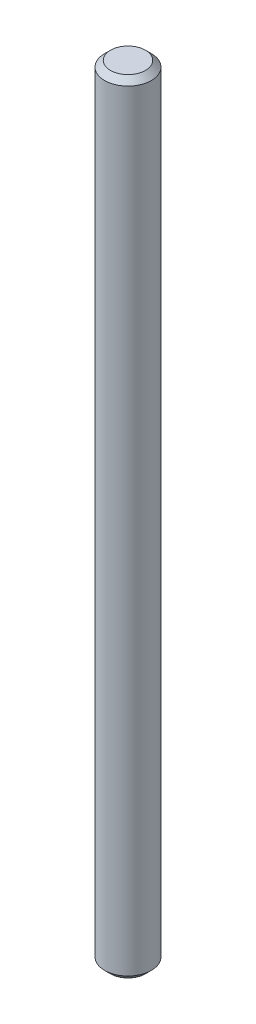
ISO-10303-21;
HEADER;
FILE_DESCRIPTION(('STEP AP214'),'2;1');
FILE_NAME('part.step','',(''),(''),'','','');
FILE_SCHEMA(('AUTOMOTIVE_DESIGN { 1 0 10303 214 1 1 1 1 }'));
ENDSEC;
DATA;
#1=APPLICATION_CONTEXT('core data for automotive mechanical design processes');
#2=APPLICATION_PROTOCOL_DEFINITION('international standard','automotive_design',2000,#1);
#3=PRODUCT_CONTEXT('',#1,'mechanical');
#4=PRODUCT('Part','Part','',(#3));
#5=PRODUCT_RELATED_PRODUCT_CATEGORY('part','',(#4));
#6=PRODUCT_DEFINITION_FORMATION('','',#4);
#7=PRODUCT_DEFINITION_CONTEXT('part definition',#1,'design');
#8=PRODUCT_DEFINITION('design','',#6,#7);
#9=PRODUCT_DEFINITION_SHAPE('','',#8);
#10=(LENGTH_UNIT() NAMED_UNIT(*) SI_UNIT(.MILLI.,.METRE.));
#11=(NAMED_UNIT(*) PLANE_ANGLE_UNIT() SI_UNIT($,.RADIAN.));
#12=(NAMED_UNIT(*) SI_UNIT($,.STERADIAN.) SOLID_ANGLE_UNIT());
#13=UNCERTAINTY_MEASURE_WITH_UNIT(LENGTH_MEASURE(1.E-05),#10,'distance_accuracy_value','');
#14=(GEOMETRIC_REPRESENTATION_CONTEXT(3) GLOBAL_UNCERTAINTY_ASSIGNED_CONTEXT((#13)) GLOBAL_UNIT_ASSIGNED_CONTEXT((#10,
#11,#12)) REPRESENTATION_CONTEXT('',''));
#15=CARTESIAN_POINT('',(0.,0.,0.));
#16=DIRECTION('',(0.,0.,1.));
#17=DIRECTION('',(1.,0.,0.));
#18=AXIS2_PLACEMENT_3D('',#15,#16,#17);
#19=CARTESIAN_POINT('',(0.,134.,0.));
#20=DIRECTION('',(0.,-1.,0.));
#21=DIRECTION('',(0.,0.,-1.));
#22=AXIS2_PLACEMENT_3D('',#19,#20,#21);
#23=CYLINDRICAL_SURFACE('',#22,4.);
#24=CARTESIAN_POINT('',(0.,0.999999999999973,0.));
#25=DIRECTION('',(0.,1.,0.));
#26=DIRECTION('',(0.,0.,1.));
#27=AXIS2_PLACEMENT_3D('',#24,#25,#26);
#28=CIRCLE('',#27,4.);
#29=CARTESIAN_POINT('',(0.,0.999999999999973,4.));
#30=VERTEX_POINT('',#29);
#31=EDGE_CURVE('E47',#30,#30,#28,.T.);
#32=ORIENTED_EDGE('',*,*,#31,.T.);
#33=EDGE_LOOP('',(#32));
#34=FACE_BOUND('',#33,.T.);
#35=CARTESIAN_POINT('',(0.,133.,0.));
#36=DIRECTION('',(0.,1.,0.));
#37=DIRECTION('',(0.,0.,1.));
#38=AXIS2_PLACEMENT_3D('',#35,#36,#37);
#39=CIRCLE('',#38,4.);
#40=CARTESIAN_POINT('',(0.,133.,4.));
#41=VERTEX_POINT('',#40);
#42=EDGE_CURVE('E51',#41,#41,#39,.F.);
#43=ORIENTED_EDGE('',*,*,#42,.T.);
#44=EDGE_LOOP('',(#43));
#45=FACE_BOUND('',#44,.T.);
#46=ADVANCED_FACE('F35',(#34,#45),#23,.T.);
#47=CARTESIAN_POINT('',(0.,134.,0.));
#48=DIRECTION('',(0.,1.,0.));
#49=DIRECTION('',(0.,0.,1.));
#50=AXIS2_PLACEMENT_3D('',#47,#48,#49);
#51=PLANE('',#50);
#52=CARTESIAN_POINT('',(0.,134.,0.));
#53=DIRECTION('',(0.,1.,0.));
#54=DIRECTION('',(0.,0.,1.));
#55=AXIS2_PLACEMENT_3D('',#52,#53,#54);
#56=CIRCLE('',#55,3.);
#57=CARTESIAN_POINT('',(0.,134.,3.));
#58=VERTEX_POINT('',#57);
#59=EDGE_CURVE('E10',#58,#58,#56,.T.);
#60=ORIENTED_EDGE('',*,*,#59,.T.);
#61=EDGE_LOOP('',(#60));
#62=FACE_BOUND('',#61,.T.);
#63=ADVANCED_FACE('F67',(#62),#51,.T.);
#64=CARTESIAN_POINT('',(0.,0.,0.));
#65=DIRECTION('',(0.,1.,0.));
#66=DIRECTION('',(0.,0.,1.));
#67=AXIS2_PLACEMENT_3D('',#64,#65,#66);
#68=PLANE('',#67);
#69=CARTESIAN_POINT('',(0.,0.,0.));
#70=DIRECTION('',(0.,1.,0.));
#71=DIRECTION('',(0.,0.,1.));
#72=AXIS2_PLACEMENT_3D('',#69,#70,#71);
#73=CIRCLE('',#72,3.00000000000002);
#74=CARTESIAN_POINT('',(0.,0.,3.00000000000002));
#75=VERTEX_POINT('',#74);
#76=EDGE_CURVE('E43',#75,#75,#73,.F.);
#77=ORIENTED_EDGE('',*,*,#76,.T.);
#78=EDGE_LOOP('',(#77));
#79=FACE_BOUND('',#78,.T.);
#80=ADVANCED_FACE('F64',(#79),#68,.F.);
#81=CARTESIAN_POINT('',(0.,0.999999999999973,0.));
#82=DIRECTION('',(0.,1.,0.));
#83=DIRECTION('',(0.,0.,1.));
#84=AXIS2_PLACEMENT_3D('',#81,#82,#83);
#85=CONICAL_SURFACE('',#84,4.,0.785398163397454);
#86=ORIENTED_EDGE('',*,*,#76,.F.);
#87=EDGE_LOOP('',(#86));
#88=FACE_BOUND('',#87,.T.);
#89=ORIENTED_EDGE('',*,*,#31,.F.);
#90=EDGE_LOOP('',(#89));
#91=FACE_BOUND('',#90,.T.);
#92=ADVANCED_FACE('F60',(#88,#91),#85,.T.);
#93=CARTESIAN_POINT('',(0.,134.,0.));
#94=DIRECTION('',(0.,-1.,0.));
#95=DIRECTION('',(0.,0.,-1.));
#96=AXIS2_PLACEMENT_3D('',#93,#94,#95);
#97=CONICAL_SURFACE('',#96,3.,0.785398163397447);
#98=ORIENTED_EDGE('',*,*,#42,.F.);
#99=EDGE_LOOP('',(#98));
#100=FACE_BOUND('',#99,.T.);
#101=ORIENTED_EDGE('',*,*,#59,.F.);
#102=EDGE_LOOP('',(#101));
#103=FACE_BOUND('',#102,.T.);
#104=ADVANCED_FACE('F38',(#100,#103),#97,.T.);
#105=CLOSED_SHELL('',(#46,#63,#80,#92,#104));
#106=MANIFOLD_SOLID_BREP('B2',#105);
#107=ADVANCED_BREP_SHAPE_REPRESENTATION('',(#18,#106),#14);
#108=SHAPE_DEFINITION_REPRESENTATION(#9,#107);
ENDSEC;
END-ISO-10303-21;
